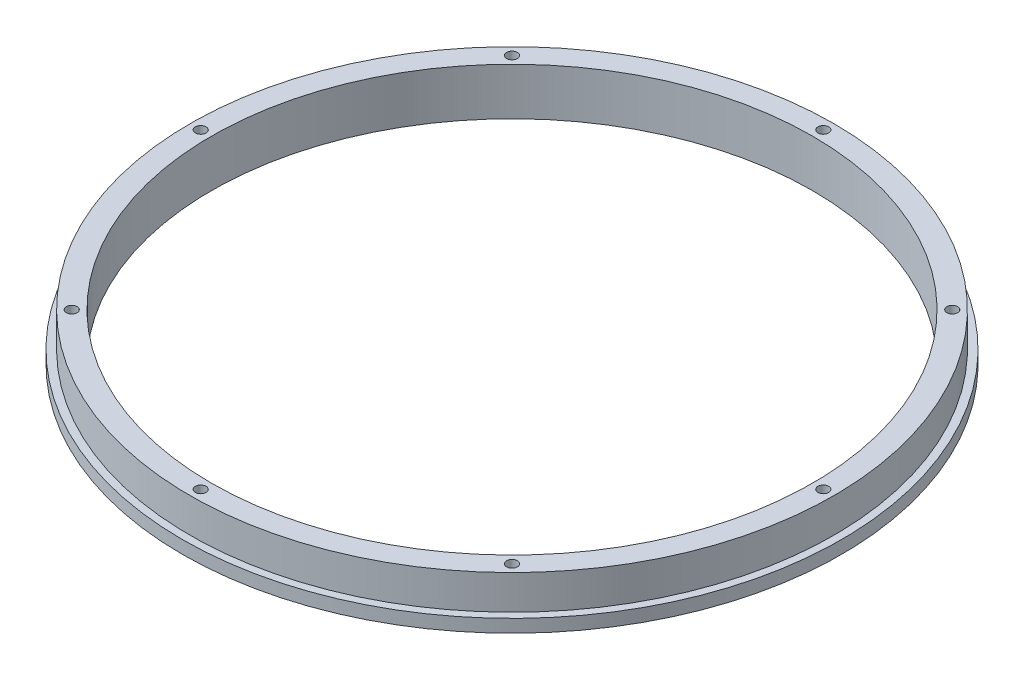
ISO-10303-21;
HEADER;
FILE_DESCRIPTION(('STEP AP214'),'2;1');
FILE_NAME('part.step','',(''),(''),'','','');
FILE_SCHEMA(('AUTOMOTIVE_DESIGN { 1 0 10303 214 1 1 1 1 }'));
ENDSEC;
DATA;
#1=APPLICATION_CONTEXT('core data for automotive mechanical design processes');
#2=APPLICATION_PROTOCOL_DEFINITION('international standard','automotive_design',2000,#1);
#3=PRODUCT_CONTEXT('',#1,'mechanical');
#4=PRODUCT('Part','Part','',(#3));
#5=PRODUCT_RELATED_PRODUCT_CATEGORY('part','',(#4));
#6=PRODUCT_DEFINITION_FORMATION('','',#4);
#7=PRODUCT_DEFINITION_CONTEXT('part definition',#1,'design');
#8=PRODUCT_DEFINITION('design','',#6,#7);
#9=PRODUCT_DEFINITION_SHAPE('','',#8);
#10=(LENGTH_UNIT() NAMED_UNIT(*) SI_UNIT(.MILLI.,.METRE.));
#11=(NAMED_UNIT(*) PLANE_ANGLE_UNIT() SI_UNIT($,.RADIAN.));
#12=(NAMED_UNIT(*) SI_UNIT($,.STERADIAN.) SOLID_ANGLE_UNIT());
#13=UNCERTAINTY_MEASURE_WITH_UNIT(LENGTH_MEASURE(1.E-05),#10,'distance_accuracy_value','');
#14=(GEOMETRIC_REPRESENTATION_CONTEXT(3) GLOBAL_UNCERTAINTY_ASSIGNED_CONTEXT((#13)) GLOBAL_UNIT_ASSIGNED_CONTEXT((#10,
#11,#12)) REPRESENTATION_CONTEXT('',''));
#15=CARTESIAN_POINT('',(0.,0.,0.));
#16=DIRECTION('',(0.,0.,1.));
#17=DIRECTION('',(1.,0.,0.));
#18=AXIS2_PLACEMENT_3D('',#15,#16,#17);
#19=CARTESIAN_POINT('',(0.,51.694672702054,0.));
#20=DIRECTION('',(0.,1.,0.));
#21=DIRECTION('',(0.,0.,-1.));
#22=AXIS2_PLACEMENT_3D('',#19,#20,#21);
#23=CYLINDRICAL_SURFACE('',#22,70.);
#24=CARTESIAN_POINT('',(0.,0.,0.));
#25=DIRECTION('',(0.,-1.,0.));
#26=DIRECTION('',(0.,0.,-1.));
#27=AXIS2_PLACEMENT_3D('',#24,#25,#26);
#28=CIRCLE('',#27,70.);
#29=CARTESIAN_POINT('',(0.,0.,-70.));
#30=VERTEX_POINT('',#29);
#31=EDGE_CURVE('E10',#30,#30,#28,.T.);
#32=ORIENTED_EDGE('',*,*,#31,.T.);
#33=EDGE_LOOP('',(#32));
#34=FACE_BOUND('',#33,.T.);
#35=CARTESIAN_POINT('',(0.,11.,0.));
#36=DIRECTION('',(0.,-1.,0.));
#37=DIRECTION('',(0.,0.,-1.));
#38=AXIS2_PLACEMENT_3D('',#35,#36,#37);
#39=CIRCLE('',#38,70.);
#40=CARTESIAN_POINT('',(0.,11.,-70.));
#41=VERTEX_POINT('',#40);
#42=EDGE_CURVE('E56',#41,#41,#39,.T.);
#43=ORIENTED_EDGE('',*,*,#42,.F.);
#44=EDGE_LOOP('',(#43));
#45=FACE_BOUND('',#44,.T.);
#46=ADVANCED_FACE('F34',(#34,#45),#23,.F.);
#47=CARTESIAN_POINT('',(70.,0.,0.));
#48=DIRECTION('',(0.,1.,0.));
#49=DIRECTION('',(0.,0.,-1.));
#50=AXIS2_PLACEMENT_3D('',#47,#48,#49);
#51=PLANE('',#50);
#52=CARTESIAN_POINT('',(-51.2652416360247,0.,51.2652416360247));
#53=DIRECTION('',(0.,-1.,0.));
#54=DIRECTION('',(0.,0.,-1.));
#55=AXIS2_PLACEMENT_3D('',#52,#53,#54);
#56=CIRCLE('',#55,1.25);
#57=CARTESIAN_POINT('',(-51.2652416360247,0.,50.0152416360247));
#58=VERTEX_POINT('',#57);
#59=EDGE_CURVE('E101',#58,#58,#56,.T.);
#60=ORIENTED_EDGE('',*,*,#59,.F.);
#61=EDGE_LOOP('',(#60));
#62=FACE_BOUND('',#61,.T.);
#63=CARTESIAN_POINT('',(0.,0.,72.5));
#64=DIRECTION('',(0.,-1.,0.));
#65=DIRECTION('',(0.,0.,-1.));
#66=AXIS2_PLACEMENT_3D('',#63,#64,#65);
#67=CIRCLE('',#66,1.25);
#68=CARTESIAN_POINT('',(0.,0.,71.25));
#69=VERTEX_POINT('',#68);
#70=EDGE_CURVE('E95',#69,#69,#67,.T.);
#71=ORIENTED_EDGE('',*,*,#70,.F.);
#72=EDGE_LOOP('',(#71));
#73=FACE_BOUND('',#72,.T.);
#74=CARTESIAN_POINT('',(51.2652416360247,0.,51.2652416360247));
#75=DIRECTION('',(0.,-1.,0.));
#76=DIRECTION('',(0.,0.,-1.));
#77=AXIS2_PLACEMENT_3D('',#74,#75,#76);
#78=CIRCLE('',#77,1.24999999999999);
#79=CARTESIAN_POINT('',(51.2652416360247,0.,50.0152416360247));
#80=VERTEX_POINT('',#79);
#81=EDGE_CURVE('E89',#80,#80,#78,.T.);
#82=ORIENTED_EDGE('',*,*,#81,.F.);
#83=EDGE_LOOP('',(#82));
#84=FACE_BOUND('',#83,.T.);
#85=CARTESIAN_POINT('',(72.5,0.,0.));
#86=DIRECTION('',(0.,-1.,0.));
#87=DIRECTION('',(0.,0.,-1.));
#88=AXIS2_PLACEMENT_3D('',#85,#86,#87);
#89=CIRCLE('',#88,1.25);
#90=CARTESIAN_POINT('',(72.5,0.,-1.25));
#91=VERTEX_POINT('',#90);
#92=EDGE_CURVE('E83',#91,#91,#89,.T.);
#93=ORIENTED_EDGE('',*,*,#92,.F.);
#94=EDGE_LOOP('',(#93));
#95=FACE_BOUND('',#94,.T.);
#96=CARTESIAN_POINT('',(51.2652416360247,0.,-51.2652416360247));
#97=DIRECTION('',(0.,-1.,0.));
#98=DIRECTION('',(0.,0.,-1.));
#99=AXIS2_PLACEMENT_3D('',#96,#97,#98);
#100=CIRCLE('',#99,1.25);
#101=CARTESIAN_POINT('',(51.2652416360247,0.,-52.5152416360247));
#102=VERTEX_POINT('',#101);
#103=EDGE_CURVE('E77',#102,#102,#100,.T.);
#104=ORIENTED_EDGE('',*,*,#103,.F.);
#105=EDGE_LOOP('',(#104));
#106=FACE_BOUND('',#105,.T.);
#107=CARTESIAN_POINT('',(0.,0.,-72.5));
#108=DIRECTION('',(0.,-1.,0.));
#109=DIRECTION('',(0.,0.,-1.));
#110=AXIS2_PLACEMENT_3D('',#107,#108,#109);
#111=CIRCLE('',#110,1.25);
#112=CARTESIAN_POINT('',(0.,0.,-73.75));
#113=VERTEX_POINT('',#112);
#114=EDGE_CURVE('E71',#113,#113,#111,.T.);
#115=ORIENTED_EDGE('',*,*,#114,.F.);
#116=EDGE_LOOP('',(#115));
#117=FACE_BOUND('',#116,.T.);
#118=CARTESIAN_POINT('',(-51.2652416360247,0.,-51.2652416360247));
#119=DIRECTION('',(0.,-1.,0.));
#120=DIRECTION('',(0.,0.,-1.));
#121=AXIS2_PLACEMENT_3D('',#118,#119,#120);
#122=CIRCLE('',#121,1.24999999999999);
#123=CARTESIAN_POINT('',(-51.2652416360247,0.,-52.5152416360247));
#124=VERTEX_POINT('',#123);
#125=EDGE_CURVE('E65',#124,#124,#122,.T.);
#126=ORIENTED_EDGE('',*,*,#125,.F.);
#127=EDGE_LOOP('',(#126));
#128=FACE_BOUND('',#127,.T.);
#129=CARTESIAN_POINT('',(-72.5,0.,0.));
#130=DIRECTION('',(0.,-1.,0.));
#131=DIRECTION('',(0.,0.,-1.));
#132=AXIS2_PLACEMENT_3D('',#129,#130,#131);
#133=CIRCLE('',#132,1.25);
#134=CARTESIAN_POINT('',(-72.5,0.,-1.25000000000001));
#135=VERTEX_POINT('',#134);
#136=EDGE_CURVE('E59',#135,#135,#133,.T.);
#137=ORIENTED_EDGE('',*,*,#136,.F.);
#138=EDGE_LOOP('',(#137));
#139=FACE_BOUND('',#138,.T.);
#140=CARTESIAN_POINT('',(0.,0.,0.));
#141=DIRECTION('',(0.,-1.,0.));
#142=DIRECTION('',(0.,0.,-1.));
#143=AXIS2_PLACEMENT_3D('',#140,#141,#142);
#144=CIRCLE('',#143,76.75);
#145=CARTESIAN_POINT('',(0.,0.,-76.75));
#146=VERTEX_POINT('',#145);
#147=EDGE_CURVE('E40',#146,#146,#144,.T.);
#148=ORIENTED_EDGE('',*,*,#147,.T.);
#149=EDGE_LOOP('',(#148));
#150=FACE_BOUND('',#149,.T.);
#151=ORIENTED_EDGE('',*,*,#31,.F.);
#152=EDGE_LOOP('',(#151));
#153=FACE_BOUND('',#152,.T.);
#154=ADVANCED_FACE('F123',(#62,#73,#84,#95,#106,#117,#128,#139,#150,#153),#51,.F.);
#155=CARTESIAN_POINT('',(0.,51.694672702054,0.));
#156=DIRECTION('',(0.,1.,0.));
#157=DIRECTION('',(0.,0.,-1.));
#158=AXIS2_PLACEMENT_3D('',#155,#156,#157);
#159=CYLINDRICAL_SURFACE('',#158,76.75);
#160=CARTESIAN_POINT('',(0.,3.,0.));
#161=DIRECTION('',(0.,-1.,0.));
#162=DIRECTION('',(0.,0.,-1.));
#163=AXIS2_PLACEMENT_3D('',#160,#161,#162);
#164=CIRCLE('',#163,76.75);
#165=CARTESIAN_POINT('',(0.,3.,-76.75));
#166=VERTEX_POINT('',#165);
#167=EDGE_CURVE('E44',#166,#166,#164,.T.);
#168=ORIENTED_EDGE('',*,*,#167,.T.);
#169=EDGE_LOOP('',(#168));
#170=FACE_BOUND('',#169,.T.);
#171=ORIENTED_EDGE('',*,*,#147,.F.);
#172=EDGE_LOOP('',(#171));
#173=FACE_BOUND('',#172,.T.);
#174=ADVANCED_FACE('F127',(#170,#173),#159,.T.);
#175=CARTESIAN_POINT('',(76.75,3.,0.));
#176=DIRECTION('',(0.,-1.,0.));
#177=DIRECTION('',(0.,0.,1.));
#178=AXIS2_PLACEMENT_3D('',#175,#176,#177);
#179=PLANE('',#178);
#180=CARTESIAN_POINT('',(0.,3.,0.));
#181=DIRECTION('',(0.,-1.,0.));
#182=DIRECTION('',(0.,0.,-1.));
#183=AXIS2_PLACEMENT_3D('',#180,#181,#182);
#184=CIRCLE('',#183,75.);
#185=CARTESIAN_POINT('',(0.,3.,-75.));
#186=VERTEX_POINT('',#185);
#187=EDGE_CURVE('E48',#186,#186,#184,.T.);
#188=ORIENTED_EDGE('',*,*,#187,.T.);
#189=EDGE_LOOP('',(#188));
#190=FACE_BOUND('',#189,.T.);
#191=ORIENTED_EDGE('',*,*,#167,.F.);
#192=EDGE_LOOP('',(#191));
#193=FACE_BOUND('',#192,.T.);
#194=ADVANCED_FACE('F141',(#190,#193),#179,.F.);
#195=CARTESIAN_POINT('',(0.,51.694672702054,0.));
#196=DIRECTION('',(0.,1.,0.));
#197=DIRECTION('',(0.,0.,-1.));
#198=AXIS2_PLACEMENT_3D('',#195,#196,#197);
#199=CYLINDRICAL_SURFACE('',#198,75.);
#200=CARTESIAN_POINT('',(0.,11.,0.));
#201=DIRECTION('',(0.,-1.,0.));
#202=DIRECTION('',(0.,0.,-1.));
#203=AXIS2_PLACEMENT_3D('',#200,#201,#202);
#204=CIRCLE('',#203,75.);
#205=CARTESIAN_POINT('',(0.,11.,-75.));
#206=VERTEX_POINT('',#205);
#207=EDGE_CURVE('E53',#206,#206,#204,.T.);
#208=ORIENTED_EDGE('',*,*,#207,.T.);
#209=EDGE_LOOP('',(#208));
#210=FACE_BOUND('',#209,.T.);
#211=ORIENTED_EDGE('',*,*,#187,.F.);
#212=EDGE_LOOP('',(#211));
#213=FACE_BOUND('',#212,.T.);
#214=ADVANCED_FACE('F135',(#210,#213),#199,.T.);
#215=CARTESIAN_POINT('',(75.,11.,0.));
#216=DIRECTION('',(0.,-1.,0.));
#217=DIRECTION('',(0.,0.,1.));
#218=AXIS2_PLACEMENT_3D('',#215,#216,#217);
#219=PLANE('',#218);
#220=CARTESIAN_POINT('',(-51.2652416360247,11.,51.2652416360247));
#221=DIRECTION('',(0.,-1.,0.));
#222=DIRECTION('',(0.,0.,-1.));
#223=AXIS2_PLACEMENT_3D('',#220,#221,#222);
#224=CIRCLE('',#223,1.24999999999999);
#225=CARTESIAN_POINT('',(-51.2652416360247,11.,50.0152416360247));
#226=VERTEX_POINT('',#225);
#227=EDGE_CURVE('E104',#226,#226,#224,.T.);
#228=ORIENTED_EDGE('',*,*,#227,.T.);
#229=EDGE_LOOP('',(#228));
#230=FACE_BOUND('',#229,.T.);
#231=CARTESIAN_POINT('',(0.,11.,72.5));
#232=DIRECTION('',(0.,-1.,0.));
#233=DIRECTION('',(0.,0.,-1.));
#234=AXIS2_PLACEMENT_3D('',#231,#232,#233);
#235=CIRCLE('',#234,1.24999999999999);
#236=CARTESIAN_POINT('',(0.,11.,71.25));
#237=VERTEX_POINT('',#236);
#238=EDGE_CURVE('E98',#237,#237,#235,.T.);
#239=ORIENTED_EDGE('',*,*,#238,.T.);
#240=EDGE_LOOP('',(#239));
#241=FACE_BOUND('',#240,.T.);
#242=CARTESIAN_POINT('',(51.2652416360247,11.,51.2652416360247));
#243=DIRECTION('',(0.,-1.,0.));
#244=DIRECTION('',(0.,0.,-1.));
#245=AXIS2_PLACEMENT_3D('',#242,#243,#244);
#246=CIRCLE('',#245,1.24999999999999);
#247=CARTESIAN_POINT('',(51.2652416360247,11.,50.0152416360247));
#248=VERTEX_POINT('',#247);
#249=EDGE_CURVE('E92',#248,#248,#246,.T.);
#250=ORIENTED_EDGE('',*,*,#249,.T.);
#251=EDGE_LOOP('',(#250));
#252=FACE_BOUND('',#251,.T.);
#253=CARTESIAN_POINT('',(72.5,11.,0.));
#254=DIRECTION('',(0.,-1.,0.));
#255=DIRECTION('',(0.,0.,-1.));
#256=AXIS2_PLACEMENT_3D('',#253,#254,#255);
#257=CIRCLE('',#256,1.24999999999999);
#258=CARTESIAN_POINT('',(72.5,11.,-1.24999999999998));
#259=VERTEX_POINT('',#258);
#260=EDGE_CURVE('E86',#259,#259,#257,.T.);
#261=ORIENTED_EDGE('',*,*,#260,.T.);
#262=EDGE_LOOP('',(#261));
#263=FACE_BOUND('',#262,.T.);
#264=CARTESIAN_POINT('',(51.2652416360247,11.,-51.2652416360247));
#265=DIRECTION('',(0.,-1.,0.));
#266=DIRECTION('',(0.,0.,-1.));
#267=AXIS2_PLACEMENT_3D('',#264,#265,#266);
#268=CIRCLE('',#267,1.24999999999999);
#269=CARTESIAN_POINT('',(51.2652416360247,11.,-52.5152416360247));
#270=VERTEX_POINT('',#269);
#271=EDGE_CURVE('E80',#270,#270,#268,.T.);
#272=ORIENTED_EDGE('',*,*,#271,.T.);
#273=EDGE_LOOP('',(#272));
#274=FACE_BOUND('',#273,.T.);
#275=CARTESIAN_POINT('',(0.,11.,-72.5));
#276=DIRECTION('',(0.,-1.,0.));
#277=DIRECTION('',(0.,0.,-1.));
#278=AXIS2_PLACEMENT_3D('',#275,#276,#277);
#279=CIRCLE('',#278,1.24999999999999);
#280=CARTESIAN_POINT('',(0.,11.,-73.75));
#281=VERTEX_POINT('',#280);
#282=EDGE_CURVE('E74',#281,#281,#279,.T.);
#283=ORIENTED_EDGE('',*,*,#282,.T.);
#284=EDGE_LOOP('',(#283));
#285=FACE_BOUND('',#284,.T.);
#286=CARTESIAN_POINT('',(-51.2652416360247,11.,-51.2652416360247));
#287=DIRECTION('',(0.,-1.,0.));
#288=DIRECTION('',(0.,0.,-1.));
#289=AXIS2_PLACEMENT_3D('',#286,#287,#288);
#290=CIRCLE('',#289,1.24999999999999);
#291=CARTESIAN_POINT('',(-51.2652416360247,11.,-52.5152416360247));
#292=VERTEX_POINT('',#291);
#293=EDGE_CURVE('E68',#292,#292,#290,.T.);
#294=ORIENTED_EDGE('',*,*,#293,.T.);
#295=EDGE_LOOP('',(#294));
#296=FACE_BOUND('',#295,.T.);
#297=CARTESIAN_POINT('',(-72.5,11.,0.));
#298=DIRECTION('',(0.,-1.,0.));
#299=DIRECTION('',(0.,0.,-1.));
#300=AXIS2_PLACEMENT_3D('',#297,#298,#299);
#301=CIRCLE('',#300,1.24999999999999);
#302=CARTESIAN_POINT('',(-72.5,11.,-1.25));
#303=VERTEX_POINT('',#302);
#304=EDGE_CURVE('E62',#303,#303,#301,.T.);
#305=ORIENTED_EDGE('',*,*,#304,.T.);
#306=EDGE_LOOP('',(#305));
#307=FACE_BOUND('',#306,.T.);
#308=ORIENTED_EDGE('',*,*,#42,.T.);
#309=EDGE_LOOP('',(#308));
#310=FACE_BOUND('',#309,.T.);
#311=ORIENTED_EDGE('',*,*,#207,.F.);
#312=EDGE_LOOP('',(#311));
#313=FACE_BOUND('',#312,.T.);
#314=ADVANCED_FACE('F108',(#230,#241,#252,#263,#274,#285,#296,#307,#310,#313),#219,.F.);
#315=CARTESIAN_POINT('',(-72.5,11.,0.));
#316=DIRECTION('',(0.,1.,0.));
#317=DIRECTION('',(0.,0.,-1.));
#318=AXIS2_PLACEMENT_3D('',#315,#316,#317);
#319=CYLINDRICAL_SURFACE('',#318,1.24999999999999);
#320=ORIENTED_EDGE('',*,*,#136,.T.);
#321=EDGE_LOOP('',(#320));
#322=FACE_BOUND('',#321,.T.);
#323=ORIENTED_EDGE('',*,*,#304,.F.);
#324=EDGE_LOOP('',(#323));
#325=FACE_BOUND('',#324,.T.);
#326=ADVANCED_FACE('F134',(#322,#325),#319,.F.);
#327=CARTESIAN_POINT('',(-51.2652416360247,11.,-51.2652416360247));
#328=DIRECTION('',(0.,1.,0.));
#329=DIRECTION('',(0.,0.,-1.));
#330=AXIS2_PLACEMENT_3D('',#327,#328,#329);
#331=CYLINDRICAL_SURFACE('',#330,1.24999999999999);
#332=ORIENTED_EDGE('',*,*,#125,.T.);
#333=EDGE_LOOP('',(#332));
#334=FACE_BOUND('',#333,.T.);
#335=ORIENTED_EDGE('',*,*,#293,.F.);
#336=EDGE_LOOP('',(#335));
#337=FACE_BOUND('',#336,.T.);
#338=ADVANCED_FACE('F158',(#334,#337),#331,.F.);
#339=CARTESIAN_POINT('',(0.,11.,-72.5));
#340=DIRECTION('',(0.,1.,0.));
#341=DIRECTION('',(0.,0.,-1.));
#342=AXIS2_PLACEMENT_3D('',#339,#340,#341);
#343=CYLINDRICAL_SURFACE('',#342,1.24999999999999);
#344=ORIENTED_EDGE('',*,*,#114,.T.);
#345=EDGE_LOOP('',(#344));
#346=FACE_BOUND('',#345,.T.);
#347=ORIENTED_EDGE('',*,*,#282,.F.);
#348=EDGE_LOOP('',(#347));
#349=FACE_BOUND('',#348,.T.);
#350=ADVANCED_FACE('F162',(#346,#349),#343,.F.);
#351=CARTESIAN_POINT('',(51.2652416360247,11.,-51.2652416360247));
#352=DIRECTION('',(0.,1.,0.));
#353=DIRECTION('',(0.,0.,-1.));
#354=AXIS2_PLACEMENT_3D('',#351,#352,#353);
#355=CYLINDRICAL_SURFACE('',#354,1.24999999999999);
#356=ORIENTED_EDGE('',*,*,#103,.T.);
#357=EDGE_LOOP('',(#356));
#358=FACE_BOUND('',#357,.T.);
#359=ORIENTED_EDGE('',*,*,#271,.F.);
#360=EDGE_LOOP('',(#359));
#361=FACE_BOUND('',#360,.T.);
#362=ADVANCED_FACE('F166',(#358,#361),#355,.F.);
#363=CARTESIAN_POINT('',(72.5,11.,0.));
#364=DIRECTION('',(0.,1.,0.));
#365=DIRECTION('',(0.,0.,-1.));
#366=AXIS2_PLACEMENT_3D('',#363,#364,#365);
#367=CYLINDRICAL_SURFACE('',#366,1.24999999999999);
#368=ORIENTED_EDGE('',*,*,#92,.T.);
#369=EDGE_LOOP('',(#368));
#370=FACE_BOUND('',#369,.T.);
#371=ORIENTED_EDGE('',*,*,#260,.F.);
#372=EDGE_LOOP('',(#371));
#373=FACE_BOUND('',#372,.T.);
#374=ADVANCED_FACE('F170',(#370,#373),#367,.F.);
#375=CARTESIAN_POINT('',(51.2652416360247,11.,51.2652416360247));
#376=DIRECTION('',(0.,1.,0.));
#377=DIRECTION('',(0.,0.,-1.));
#378=AXIS2_PLACEMENT_3D('',#375,#376,#377);
#379=CYLINDRICAL_SURFACE('',#378,1.24999999999999);
#380=ORIENTED_EDGE('',*,*,#81,.T.);
#381=EDGE_LOOP('',(#380));
#382=FACE_BOUND('',#381,.T.);
#383=ORIENTED_EDGE('',*,*,#249,.F.);
#384=EDGE_LOOP('',(#383));
#385=FACE_BOUND('',#384,.T.);
#386=ADVANCED_FACE('F119',(#382,#385),#379,.F.);
#387=CARTESIAN_POINT('',(0.,11.,72.5));
#388=DIRECTION('',(0.,1.,0.));
#389=DIRECTION('',(0.,0.,-1.));
#390=AXIS2_PLACEMENT_3D('',#387,#388,#389);
#391=CYLINDRICAL_SURFACE('',#390,1.24999999999999);
#392=ORIENTED_EDGE('',*,*,#70,.T.);
#393=EDGE_LOOP('',(#392));
#394=FACE_BOUND('',#393,.T.);
#395=ORIENTED_EDGE('',*,*,#238,.F.);
#396=EDGE_LOOP('',(#395));
#397=FACE_BOUND('',#396,.T.);
#398=ADVANCED_FACE('F113',(#394,#397),#391,.F.);
#399=CARTESIAN_POINT('',(-51.2652416360247,11.,51.2652416360247));
#400=DIRECTION('',(0.,1.,0.));
#401=DIRECTION('',(0.,0.,-1.));
#402=AXIS2_PLACEMENT_3D('',#399,#400,#401);
#403=CYLINDRICAL_SURFACE('',#402,1.24999999999999);
#404=ORIENTED_EDGE('',*,*,#59,.T.);
#405=EDGE_LOOP('',(#404));
#406=FACE_BOUND('',#405,.T.);
#407=ORIENTED_EDGE('',*,*,#227,.F.);
#408=EDGE_LOOP('',(#407));
#409=FACE_BOUND('',#408,.T.);
#410=ADVANCED_FACE('F111',(#406,#409),#403,.F.);
#411=CLOSED_SHELL('',(#46,#154,#174,#194,#214,#314,#326,#338,#350,#362,#374,#386,#398,#410));
#412=MANIFOLD_SOLID_BREP('B2',#411);
#413=ADVANCED_BREP_SHAPE_REPRESENTATION('',(#18,#412),#14);
#414=SHAPE_DEFINITION_REPRESENTATION(#9,#413);
ENDSEC;
END-ISO-10303-21;
